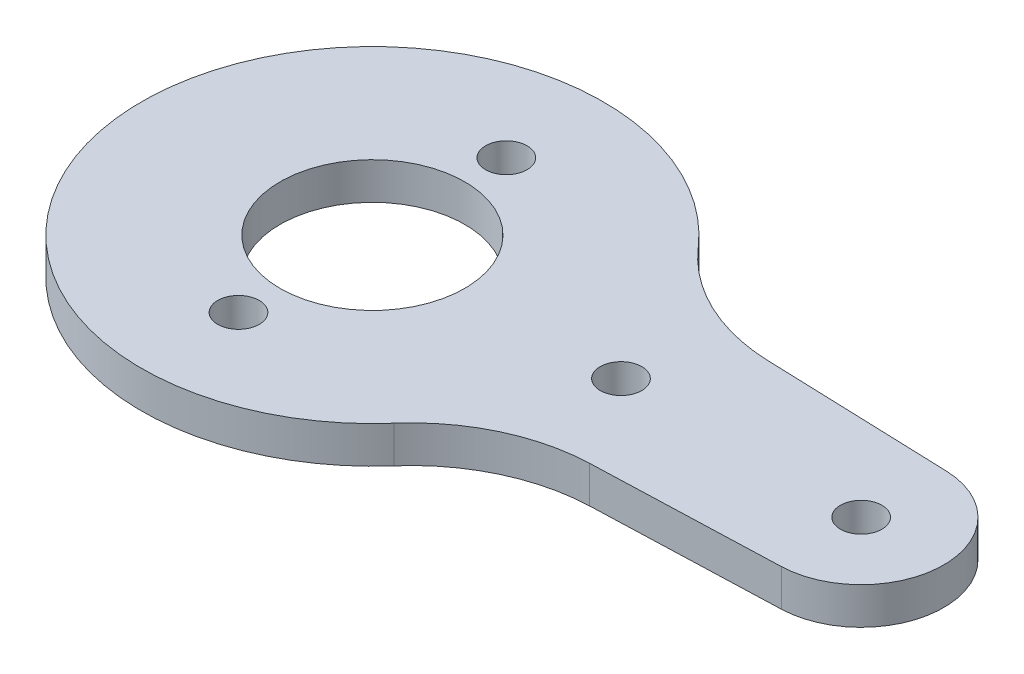
ISO-10303-21;
HEADER;
FILE_DESCRIPTION(('STEP AP214'),'2;1');
FILE_NAME('part.step','',(''),(''),'','','');
FILE_SCHEMA(('AUTOMOTIVE_DESIGN { 1 0 10303 214 1 1 1 1 }'));
ENDSEC;
DATA;
#1=APPLICATION_CONTEXT('core data for automotive mechanical design processes');
#2=APPLICATION_PROTOCOL_DEFINITION('international standard','automotive_design',2000,#1);
#3=PRODUCT_CONTEXT('',#1,'mechanical');
#4=PRODUCT('Part','Part','',(#3));
#5=PRODUCT_RELATED_PRODUCT_CATEGORY('part','',(#4));
#6=PRODUCT_DEFINITION_FORMATION('','',#4);
#7=PRODUCT_DEFINITION_CONTEXT('part definition',#1,'design');
#8=PRODUCT_DEFINITION('design','',#6,#7);
#9=PRODUCT_DEFINITION_SHAPE('','',#8);
#10=(LENGTH_UNIT() NAMED_UNIT(*) SI_UNIT(.MILLI.,.METRE.));
#11=(NAMED_UNIT(*) PLANE_ANGLE_UNIT() SI_UNIT($,.RADIAN.));
#12=(NAMED_UNIT(*) SI_UNIT($,.STERADIAN.) SOLID_ANGLE_UNIT());
#13=UNCERTAINTY_MEASURE_WITH_UNIT(LENGTH_MEASURE(1.E-05),#10,'distance_accuracy_value','');
#14=(GEOMETRIC_REPRESENTATION_CONTEXT(3) GLOBAL_UNCERTAINTY_ASSIGNED_CONTEXT((#13)) GLOBAL_UNIT_ASSIGNED_CONTEXT((#10,
#11,#12)) REPRESENTATION_CONTEXT('',''));
#15=CARTESIAN_POINT('',(0.,0.,0.));
#16=DIRECTION('',(0.,0.,1.));
#17=DIRECTION('',(1.,0.,0.));
#18=AXIS2_PLACEMENT_3D('',#15,#16,#17);
#19=CARTESIAN_POINT('',(0.,4.,0.));
#20=DIRECTION('',(0.,-1.,0.));
#21=DIRECTION('',(0.,0.,-1.));
#22=AXIS2_PLACEMENT_3D('',#19,#20,#21);
#23=CYLINDRICAL_SURFACE('',#22,25.);
#24=CARTESIAN_POINT('',(0.,0.,0.));
#25=DIRECTION('',(0.,1.,0.));
#26=DIRECTION('',(0.,0.,1.));
#27=AXIS2_PLACEMENT_3D('',#24,#25,#26);
#28=CIRCLE('',#27,25.);
#29=CARTESIAN_POINT('',(18.8159246301581,0.,-16.4608924518755));
#30=VERTEX_POINT('',#29);
#31=CARTESIAN_POINT('',(18.8159246301582,0.,16.4608924518754));
#32=VERTEX_POINT('',#31);
#33=EDGE_CURVE('E128',#30,#32,#28,.T.);
#34=ORIENTED_EDGE('',*,*,#33,.T.);
#35=DIRECTION('',(0.,-1.,0.));
#36=VECTOR('',#35,1.);
#37=CARTESIAN_POINT('',(18.8159246301582,4.,16.4608924518754));
#38=LINE('',#37,#36);
#39=CARTESIAN_POINT('',(18.8159246301582,4.,16.4608924518754));
#40=VERTEX_POINT('',#39);
#41=EDGE_CURVE('E149',#32,#40,#38,.F.);
#42=ORIENTED_EDGE('',*,*,#41,.T.);
#43=CARTESIAN_POINT('',(0.,4.,0.));
#44=DIRECTION('',(0.,1.,0.));
#45=DIRECTION('',(0.,0.,1.));
#46=AXIS2_PLACEMENT_3D('',#43,#44,#45);
#47=CIRCLE('',#46,25.);
#48=CARTESIAN_POINT('',(18.8159246301581,4.,-16.4608924518755));
#49=VERTEX_POINT('',#48);
#50=EDGE_CURVE('E106',#49,#40,#47,.T.);
#51=ORIENTED_EDGE('',*,*,#50,.F.);
#52=DIRECTION('',(0.,-1.,0.));
#53=VECTOR('',#52,1.);
#54=CARTESIAN_POINT('',(18.8159246301581,4.,-16.4608924518755));
#55=LINE('',#54,#53);
#56=EDGE_CURVE('E145',#49,#30,#55,.T.);
#57=ORIENTED_EDGE('',*,*,#56,.T.);
#58=EDGE_LOOP('',(#34,#42,#51,#57));
#59=FACE_BOUND('',#58,.T.);
#60=ADVANCED_FACE('F40',(#59),#23,.T.);
#61=CARTESIAN_POINT('',(53.2251215973971,4.,8.94147314513735));
#62=DIRECTION('',(-0.034899496702494,0.,-0.999390827019096));
#63=DIRECTION('',(-0.999390827019096,0.,0.034899496702494));
#64=AXIS2_PLACEMENT_3D('',#61,#62,#63);
#65=PLANE('',#64);
#66=DIRECTION('',(0.999390827019096,0.,-0.034899496702494));
#67=VECTOR('',#66,1.);
#68=CARTESIAN_POINT('',(53.2251215973971,4.,8.94147314513735));
#69=LINE('',#68,#67);
#70=CARTESIAN_POINT('',(33.1706744002348,4.,9.64178987299374));
#71=VERTEX_POINT('',#70);
#72=CARTESIAN_POINT('',(53.2251215973971,4.,8.94147314513735));
#73=VERTEX_POINT('',#72);
#74=EDGE_CURVE('E93',#71,#73,#69,.T.);
#75=ORIENTED_EDGE('',*,*,#74,.F.);
#76=DIRECTION('',(0.,1.,0.));
#77=VECTOR('',#76,1.);
#78=CARTESIAN_POINT('',(33.1706744002348,0.,9.64178987299374));
#79=LINE('',#78,#77);
#80=CARTESIAN_POINT('',(33.1706744002348,0.,9.64178987299374));
#81=VERTEX_POINT('',#80);
#82=EDGE_CURVE('E116',#71,#81,#79,.F.);
#83=ORIENTED_EDGE('',*,*,#82,.T.);
#84=DIRECTION('',(0.999390827019096,0.,-0.034899496702494));
#85=VECTOR('',#84,1.);
#86=CARTESIAN_POINT('',(53.2251215973971,0.,8.94147314513735));
#87=LINE('',#86,#85);
#88=CARTESIAN_POINT('',(53.2251215973971,0.,8.94147314513735));
#89=VERTEX_POINT('',#88);
#90=EDGE_CURVE('E112',#81,#89,#87,.T.);
#91=ORIENTED_EDGE('',*,*,#90,.T.);
#92=DIRECTION('',(0.,-1.,0.));
#93=VECTOR('',#92,1.);
#94=CARTESIAN_POINT('',(53.2251215973971,4.,8.94147314513735));
#95=LINE('',#94,#93);
#96=EDGE_CURVE('E109',#73,#89,#95,.T.);
#97=ORIENTED_EDGE('',*,*,#96,.F.);
#98=EDGE_LOOP('',(#75,#83,#91,#97));
#99=FACE_BOUND('',#98,.T.);
#100=ADVANCED_FACE('F110',(#99),#65,.F.);
#101=CARTESIAN_POINT('',(52.9128784747792,4.,0.));
#102=DIRECTION('',(0.,-1.,0.));
#103=DIRECTION('',(0.,0.,-1.));
#104=AXIS2_PLACEMENT_3D('',#101,#102,#103);
#105=CYLINDRICAL_SURFACE('',#104,8.94692336911604);
#106=CARTESIAN_POINT('',(52.9128784747792,0.,0.));
#107=DIRECTION('',(0.,1.,0.));
#108=DIRECTION('',(0.,0.,-1.));
#109=AXIS2_PLACEMENT_3D('',#106,#107,#108);
#110=CIRCLE('',#109,8.94692336911604);
#111=CARTESIAN_POINT('',(53.2251215973972,0.,-8.94147314513735));
#112=VERTEX_POINT('',#111);
#113=EDGE_CURVE('E135',#89,#112,#110,.T.);
#114=ORIENTED_EDGE('',*,*,#113,.T.);
#115=DIRECTION('',(0.,-1.,0.));
#116=VECTOR('',#115,1.);
#117=CARTESIAN_POINT('',(53.2251215973972,4.,-8.94147314513735));
#118=LINE('',#117,#116);
#119=CARTESIAN_POINT('',(53.2251215973972,4.,-8.94147314513735));
#120=VERTEX_POINT('',#119);
#121=EDGE_CURVE('E117',#120,#112,#118,.T.);
#122=ORIENTED_EDGE('',*,*,#121,.F.);
#123=CARTESIAN_POINT('',(52.9128784747792,4.,0.));
#124=DIRECTION('',(0.,1.,0.));
#125=DIRECTION('',(0.,0.,-1.));
#126=AXIS2_PLACEMENT_3D('',#123,#124,#125);
#127=CIRCLE('',#126,8.94692336911604);
#128=EDGE_CURVE('E97',#73,#120,#127,.T.);
#129=ORIENTED_EDGE('',*,*,#128,.F.);
#130=ORIENTED_EDGE('',*,*,#96,.T.);
#131=EDGE_LOOP('',(#114,#122,#129,#130));
#132=FACE_BOUND('',#131,.T.);
#133=ADVANCED_FACE('F119',(#132),#105,.T.);
#134=CARTESIAN_POINT('',(22.9128784747792,4.,-10.0000000000001));
#135=DIRECTION('',(-0.0348994967025011,0.,0.999390827019096));
#136=DIRECTION('',(0.999390827019096,0.,0.0348994967025011));
#137=AXIS2_PLACEMENT_3D('',#134,#135,#136);
#138=PLANE('',#137);
#139=DIRECTION('',(-0.999390827019096,0.,-0.0348994967025011));
#140=VECTOR('',#139,1.);
#141=CARTESIAN_POINT('',(22.9128784747792,0.,-10.0000000000001));
#142=LINE('',#141,#140);
#143=CARTESIAN_POINT('',(33.1706744002346,0.,-9.64178987299389));
#144=VERTEX_POINT('',#143);
#145=EDGE_CURVE('E138',#112,#144,#142,.T.);
#146=ORIENTED_EDGE('',*,*,#145,.T.);
#147=DIRECTION('',(0.,1.,0.));
#148=VECTOR('',#147,1.);
#149=CARTESIAN_POINT('',(33.1706744002346,4.,-9.64178987299389));
#150=LINE('',#149,#148);
#151=CARTESIAN_POINT('',(33.1706744002346,4.,-9.64178987299389));
#152=VERTEX_POINT('',#151);
#153=EDGE_CURVE('E56',#144,#152,#150,.T.);
#154=ORIENTED_EDGE('',*,*,#153,.T.);
#155=DIRECTION('',(-0.999390827019096,0.,-0.0348994967025011));
#156=VECTOR('',#155,1.);
#157=CARTESIAN_POINT('',(22.9128784747792,4.,-10.0000000000001));
#158=LINE('',#157,#156);
#159=EDGE_CURVE('E122',#120,#152,#158,.T.);
#160=ORIENTED_EDGE('',*,*,#159,.F.);
#161=ORIENTED_EDGE('',*,*,#121,.T.);
#162=EDGE_LOOP('',(#146,#154,#160,#161));
#163=FACE_BOUND('',#162,.T.);
#164=ADVANCED_FACE('F184',(#163),#138,.F.);
#165=CARTESIAN_POINT('',(0.,4.,0.));
#166=DIRECTION('',(0.,1.,0.));
#167=DIRECTION('',(0.,0.,1.));
#168=AXIS2_PLACEMENT_3D('',#165,#166,#167);
#169=PLANE('',#168);
#170=CARTESIAN_POINT('',(52.9128784747792,4.,0.));
#171=DIRECTION('',(0.,1.,0.));
#172=DIRECTION('',(0.,0.,-1.));
#173=AXIS2_PLACEMENT_3D('',#170,#171,#172);
#174=CIRCLE('',#173,2.25);
#175=CARTESIAN_POINT('',(52.9128784747792,4.,-2.25));
#176=VERTEX_POINT('',#175);
#177=EDGE_CURVE('E240',#176,#176,#174,.T.);
#178=ORIENTED_EDGE('',*,*,#177,.F.);
#179=EDGE_LOOP('',(#178));
#180=FACE_BOUND('',#179,.T.);
#181=CARTESIAN_POINT('',(26.9128784747792,4.,0.));
#182=DIRECTION('',(0.,1.,0.));
#183=DIRECTION('',(0.,0.,-1.));
#184=AXIS2_PLACEMENT_3D('',#181,#182,#183);
#185=CIRCLE('',#184,2.25);
#186=CARTESIAN_POINT('',(26.9128784747792,4.,-2.25));
#187=VERTEX_POINT('',#186);
#188=EDGE_CURVE('E232',#187,#187,#185,.T.);
#189=ORIENTED_EDGE('',*,*,#188,.F.);
#190=EDGE_LOOP('',(#189));
#191=FACE_BOUND('',#190,.T.);
#192=CARTESIAN_POINT('',(0.,4.,14.5));
#193=DIRECTION('',(0.,1.,0.));
#194=DIRECTION('',(0.,0.,1.));
#195=AXIS2_PLACEMENT_3D('',#192,#193,#194);
#196=CIRCLE('',#195,2.25);
#197=CARTESIAN_POINT('',(0.,4.,16.75));
#198=VERTEX_POINT('',#197);
#199=EDGE_CURVE('E219',#198,#198,#196,.T.);
#200=ORIENTED_EDGE('',*,*,#199,.F.);
#201=EDGE_LOOP('',(#200));
#202=FACE_BOUND('',#201,.T.);
#203=CARTESIAN_POINT('',(0.,4.,-14.5));
#204=DIRECTION('',(0.,1.,0.));
#205=DIRECTION('',(0.,0.,1.));
#206=AXIS2_PLACEMENT_3D('',#203,#204,#205);
#207=CIRCLE('',#206,2.25);
#208=CARTESIAN_POINT('',(0.,4.,-12.25));
#209=VERTEX_POINT('',#208);
#210=EDGE_CURVE('E213',#209,#209,#207,.T.);
#211=ORIENTED_EDGE('',*,*,#210,.F.);
#212=EDGE_LOOP('',(#211));
#213=FACE_BOUND('',#212,.T.);
#214=CARTESIAN_POINT('',(0.,4.,0.));
#215=DIRECTION('',(0.,1.,0.));
#216=DIRECTION('',(0.,0.,1.));
#217=AXIS2_PLACEMENT_3D('',#214,#215,#216);
#218=CIRCLE('',#217,9.99999999999999);
#219=CARTESIAN_POINT('',(0.,4.,9.99999999999999));
#220=VERTEX_POINT('',#219);
#221=EDGE_CURVE('E132',#220,#220,#218,.T.);
#222=ORIENTED_EDGE('',*,*,#221,.F.);
#223=EDGE_LOOP('',(#222));
#224=FACE_BOUND('',#223,.T.);
#225=ORIENTED_EDGE('',*,*,#159,.T.);
#226=CARTESIAN_POINT('',(33.8686643342846,4.,-29.6296064133758));
#227=DIRECTION('',(0.,1.,0.));
#228=DIRECTION('',(0.,0.,1.));
#229=AXIS2_PLACEMENT_3D('',#226,#227,#228);
#230=CIRCLE('',#229,20.);
#231=EDGE_CURVE('E11',#152,#49,#230,.F.);
#232=ORIENTED_EDGE('',*,*,#231,.T.);
#233=ORIENTED_EDGE('',*,*,#50,.T.);
#234=CARTESIAN_POINT('',(33.8686643342847,4.,29.6296064133757));
#235=DIRECTION('',(0.,1.,0.));
#236=DIRECTION('',(0.,0.,1.));
#237=AXIS2_PLACEMENT_3D('',#234,#235,#236);
#238=CIRCLE('',#237,20.);
#239=EDGE_CURVE('E101',#40,#71,#238,.F.);
#240=ORIENTED_EDGE('',*,*,#239,.T.);
#241=ORIENTED_EDGE('',*,*,#74,.T.);
#242=ORIENTED_EDGE('',*,*,#128,.T.);
#243=EDGE_LOOP('',(#225,#232,#233,#240,#241,#242));
#244=FACE_BOUND('',#243,.T.);
#245=ADVANCED_FACE('F95',(#180,#191,#202,#213,#224,#244),#169,.T.);
#246=CARTESIAN_POINT('',(0.,0.,0.));
#247=DIRECTION('',(0.,1.,0.));
#248=DIRECTION('',(0.,0.,1.));
#249=AXIS2_PLACEMENT_3D('',#246,#247,#248);
#250=PLANE('',#249);
#251=CARTESIAN_POINT('',(52.9128784747792,0.,0.));
#252=DIRECTION('',(0.,1.,0.));
#253=DIRECTION('',(0.,0.,-1.));
#254=AXIS2_PLACEMENT_3D('',#251,#252,#253);
#255=CIRCLE('',#254,2.25);
#256=CARTESIAN_POINT('',(52.9128784747792,0.,-2.25));
#257=VERTEX_POINT('',#256);
#258=EDGE_CURVE('E244',#257,#257,#255,.T.);
#259=ORIENTED_EDGE('',*,*,#258,.T.);
#260=EDGE_LOOP('',(#259));
#261=FACE_BOUND('',#260,.T.);
#262=CARTESIAN_POINT('',(26.9128784747792,0.,0.));
#263=DIRECTION('',(0.,1.,0.));
#264=DIRECTION('',(0.,0.,-1.));
#265=AXIS2_PLACEMENT_3D('',#262,#263,#264);
#266=CIRCLE('',#265,2.25);
#267=CARTESIAN_POINT('',(26.9128784747792,0.,-2.25));
#268=VERTEX_POINT('',#267);
#269=EDGE_CURVE('E236',#268,#268,#266,.T.);
#270=ORIENTED_EDGE('',*,*,#269,.T.);
#271=EDGE_LOOP('',(#270));
#272=FACE_BOUND('',#271,.T.);
#273=CARTESIAN_POINT('',(0.,0.,14.5));
#274=DIRECTION('',(0.,1.,0.));
#275=DIRECTION('',(0.,0.,1.));
#276=AXIS2_PLACEMENT_3D('',#273,#274,#275);
#277=CIRCLE('',#276,2.25);
#278=CARTESIAN_POINT('',(0.,0.,16.75));
#279=VERTEX_POINT('',#278);
#280=EDGE_CURVE('E226',#279,#279,#277,.T.);
#281=ORIENTED_EDGE('',*,*,#280,.T.);
#282=EDGE_LOOP('',(#281));
#283=FACE_BOUND('',#282,.T.);
#284=CARTESIAN_POINT('',(0.,0.,-14.5));
#285=DIRECTION('',(0.,1.,0.));
#286=DIRECTION('',(0.,0.,1.));
#287=AXIS2_PLACEMENT_3D('',#284,#285,#286);
#288=CIRCLE('',#287,2.25);
#289=CARTESIAN_POINT('',(0.,0.,-12.25));
#290=VERTEX_POINT('',#289);
#291=EDGE_CURVE('E216',#290,#290,#288,.T.);
#292=ORIENTED_EDGE('',*,*,#291,.T.);
#293=EDGE_LOOP('',(#292));
#294=FACE_BOUND('',#293,.T.);
#295=CARTESIAN_POINT('',(0.,0.,0.));
#296=DIRECTION('',(0.,1.,0.));
#297=DIRECTION('',(0.,0.,1.));
#298=AXIS2_PLACEMENT_3D('',#295,#296,#297);
#299=CIRCLE('',#298,9.99999999999999);
#300=CARTESIAN_POINT('',(0.,0.,9.99999999999999));
#301=VERTEX_POINT('',#300);
#302=EDGE_CURVE('E223',#301,#301,#299,.T.);
#303=ORIENTED_EDGE('',*,*,#302,.T.);
#304=EDGE_LOOP('',(#303));
#305=FACE_BOUND('',#304,.T.);
#306=ORIENTED_EDGE('',*,*,#33,.F.);
#307=CARTESIAN_POINT('',(33.8686643342846,0.,-29.6296064133758));
#308=DIRECTION('',(0.,1.,0.));
#309=DIRECTION('',(0.,0.,1.));
#310=AXIS2_PLACEMENT_3D('',#307,#308,#309);
#311=CIRCLE('',#310,20.);
#312=EDGE_CURVE('E49',#30,#144,#311,.T.);
#313=ORIENTED_EDGE('',*,*,#312,.T.);
#314=ORIENTED_EDGE('',*,*,#145,.F.);
#315=ORIENTED_EDGE('',*,*,#113,.F.);
#316=ORIENTED_EDGE('',*,*,#90,.F.);
#317=CARTESIAN_POINT('',(33.8686643342847,0.,29.6296064133757));
#318=DIRECTION('',(0.,1.,0.));
#319=DIRECTION('',(0.,0.,1.));
#320=AXIS2_PLACEMENT_3D('',#317,#318,#319);
#321=CIRCLE('',#320,20.);
#322=EDGE_CURVE('E154',#81,#32,#321,.T.);
#323=ORIENTED_EDGE('',*,*,#322,.T.);
#324=EDGE_LOOP('',(#306,#313,#314,#315,#316,#323));
#325=FACE_BOUND('',#324,.T.);
#326=ADVANCED_FACE('F159',(#261,#272,#283,#294,#305,#325),#250,.F.);
#327=CARTESIAN_POINT('',(33.8686643342847,4.,29.6296064133757));
#328=DIRECTION('',(0.,-1.,0.));
#329=DIRECTION('',(0.,0.,-1.));
#330=AXIS2_PLACEMENT_3D('',#327,#328,#329);
#331=CYLINDRICAL_SURFACE('',#330,20.);
#332=ORIENTED_EDGE('',*,*,#239,.F.);
#333=ORIENTED_EDGE('',*,*,#41,.F.);
#334=ORIENTED_EDGE('',*,*,#322,.F.);
#335=ORIENTED_EDGE('',*,*,#82,.F.);
#336=EDGE_LOOP('',(#332,#333,#334,#335));
#337=FACE_BOUND('',#336,.T.);
#338=ADVANCED_FACE('F165',(#337),#331,.F.);
#339=CARTESIAN_POINT('',(33.8686643342846,4.,-29.6296064133758));
#340=DIRECTION('',(0.,-1.,0.));
#341=DIRECTION('',(0.,0.,-1.));
#342=AXIS2_PLACEMENT_3D('',#339,#340,#341);
#343=CYLINDRICAL_SURFACE('',#342,20.);
#344=ORIENTED_EDGE('',*,*,#231,.F.);
#345=ORIENTED_EDGE('',*,*,#153,.F.);
#346=ORIENTED_EDGE('',*,*,#312,.F.);
#347=ORIENTED_EDGE('',*,*,#56,.F.);
#348=EDGE_LOOP('',(#344,#345,#346,#347));
#349=FACE_BOUND('',#348,.T.);
#350=ADVANCED_FACE('F42',(#349),#343,.F.);
#351=CARTESIAN_POINT('',(0.,4.,0.));
#352=DIRECTION('',(0.,-1.,0.));
#353=DIRECTION('',(0.,0.,-1.));
#354=AXIS2_PLACEMENT_3D('',#351,#352,#353);
#355=CYLINDRICAL_SURFACE('',#354,9.99999999999999);
#356=ORIENTED_EDGE('',*,*,#221,.T.);
#357=EDGE_LOOP('',(#356));
#358=FACE_BOUND('',#357,.T.);
#359=ORIENTED_EDGE('',*,*,#302,.F.);
#360=EDGE_LOOP('',(#359));
#361=FACE_BOUND('',#360,.T.);
#362=ADVANCED_FACE('F171',(#358,#361),#355,.F.);
#363=CARTESIAN_POINT('',(0.,4.,-14.5));
#364=DIRECTION('',(0.,-1.,0.));
#365=DIRECTION('',(0.,0.,-1.));
#366=AXIS2_PLACEMENT_3D('',#363,#364,#365);
#367=CYLINDRICAL_SURFACE('',#366,2.25);
#368=ORIENTED_EDGE('',*,*,#210,.T.);
#369=EDGE_LOOP('',(#368));
#370=FACE_BOUND('',#369,.T.);
#371=ORIENTED_EDGE('',*,*,#291,.F.);
#372=EDGE_LOOP('',(#371));
#373=FACE_BOUND('',#372,.T.);
#374=ADVANCED_FACE('F192',(#370,#373),#367,.F.);
#375=CARTESIAN_POINT('',(0.,4.,14.5));
#376=DIRECTION('',(0.,-1.,0.));
#377=DIRECTION('',(0.,0.,-1.));
#378=AXIS2_PLACEMENT_3D('',#375,#376,#377);
#379=CYLINDRICAL_SURFACE('',#378,2.25);
#380=ORIENTED_EDGE('',*,*,#199,.T.);
#381=EDGE_LOOP('',(#380));
#382=FACE_BOUND('',#381,.T.);
#383=ORIENTED_EDGE('',*,*,#280,.F.);
#384=EDGE_LOOP('',(#383));
#385=FACE_BOUND('',#384,.T.);
#386=ADVANCED_FACE('F201',(#382,#385),#379,.F.);
#387=CARTESIAN_POINT('',(26.9128784747792,4.,0.));
#388=DIRECTION('',(0.,-1.,0.));
#389=DIRECTION('',(0.,0.,-1.));
#390=AXIS2_PLACEMENT_3D('',#387,#388,#389);
#391=CYLINDRICAL_SURFACE('',#390,2.25);
#392=ORIENTED_EDGE('',*,*,#188,.T.);
#393=EDGE_LOOP('',(#392));
#394=FACE_BOUND('',#393,.T.);
#395=ORIENTED_EDGE('',*,*,#269,.F.);
#396=EDGE_LOOP('',(#395));
#397=FACE_BOUND('',#396,.T.);
#398=ADVANCED_FACE('F197',(#394,#397),#391,.F.);
#399=CARTESIAN_POINT('',(52.9128784747792,4.,0.));
#400=DIRECTION('',(0.,-1.,0.));
#401=DIRECTION('',(0.,0.,-1.));
#402=AXIS2_PLACEMENT_3D('',#399,#400,#401);
#403=CYLINDRICAL_SURFACE('',#402,2.25);
#404=ORIENTED_EDGE('',*,*,#177,.T.);
#405=EDGE_LOOP('',(#404));
#406=FACE_BOUND('',#405,.T.);
#407=ORIENTED_EDGE('',*,*,#258,.F.);
#408=EDGE_LOOP('',(#407));
#409=FACE_BOUND('',#408,.T.);
#410=ADVANCED_FACE('F194',(#406,#409),#403,.F.);
#411=CLOSED_SHELL('',(#60,#100,#133,#164,#245,#326,#338,#350,#362,#374,#386,#398,#410));
#412=MANIFOLD_SOLID_BREP('B2',#411);
#413=ADVANCED_BREP_SHAPE_REPRESENTATION('',(#18,#412),#14);
#414=SHAPE_DEFINITION_REPRESENTATION(#9,#413);
ENDSEC;
END-ISO-10303-21;
